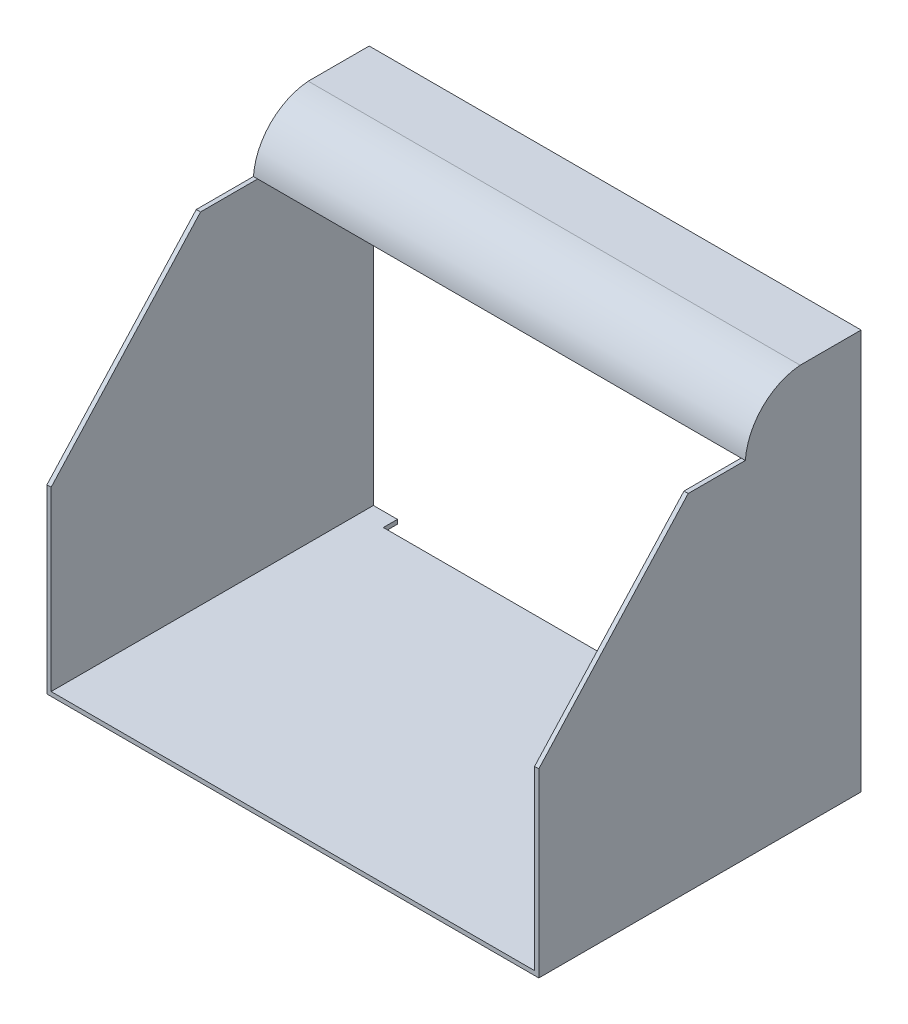
ISO-10303-21;
HEADER;
FILE_DESCRIPTION(('STEP AP214'),'2;1');
FILE_NAME('part.step','',(''),(''),'','','');
FILE_SCHEMA(('AUTOMOTIVE_DESIGN { 1 0 10303 214 1 1 1 1 }'));
ENDSEC;
DATA;
#1=APPLICATION_CONTEXT('core data for automotive mechanical design processes');
#2=APPLICATION_PROTOCOL_DEFINITION('international standard','automotive_design',2000,#1);
#3=PRODUCT_CONTEXT('',#1,'mechanical');
#4=PRODUCT('Part','Part','',(#3));
#5=PRODUCT_RELATED_PRODUCT_CATEGORY('part','',(#4));
#6=PRODUCT_DEFINITION_FORMATION('','',#4);
#7=PRODUCT_DEFINITION_CONTEXT('part definition',#1,'design');
#8=PRODUCT_DEFINITION('design','',#6,#7);
#9=PRODUCT_DEFINITION_SHAPE('','',#8);
#10=(LENGTH_UNIT() NAMED_UNIT(*) SI_UNIT(.MILLI.,.METRE.));
#11=(NAMED_UNIT(*) PLANE_ANGLE_UNIT() SI_UNIT($,.RADIAN.));
#12=(NAMED_UNIT(*) SI_UNIT($,.STERADIAN.) SOLID_ANGLE_UNIT());
#13=UNCERTAINTY_MEASURE_WITH_UNIT(LENGTH_MEASURE(1.E-05),#10,'distance_accuracy_value','');
#14=(GEOMETRIC_REPRESENTATION_CONTEXT(3) GLOBAL_UNCERTAINTY_ASSIGNED_CONTEXT((#13)) GLOBAL_UNIT_ASSIGNED_CONTEXT((#10,
#11,#12)) REPRESENTATION_CONTEXT('',''));
#15=CARTESIAN_POINT('',(0.,0.,0.));
#16=DIRECTION('',(0.,0.,1.));
#17=DIRECTION('',(1.,0.,0.));
#18=AXIS2_PLACEMENT_3D('',#15,#16,#17);
#19=CARTESIAN_POINT('',(174.,-18.,59.6619917569432));
#20=DIRECTION('',(0.,1.,0.));
#21=DIRECTION('',(0.,0.,1.));
#22=AXIS2_PLACEMENT_3D('',#19,#20,#21);
#23=PLANE('',#22);
#24=DIRECTION('',(-1.,0.,0.));
#25=VECTOR('',#24,1.);
#26=CARTESIAN_POINT('',(174.,-18.,59.6619917569432));
#27=LINE('',#26,#25);
#28=CARTESIAN_POINT('',(1.5,-18.,59.6619917569432));
#29=VERTEX_POINT('',#28);
#30=CARTESIAN_POINT('',(0.,-18.,59.6619917569432));
#31=VERTEX_POINT('',#30);
#32=EDGE_CURVE('E356',#29,#31,#27,.T.);
#33=ORIENTED_EDGE('',*,*,#32,.F.);
#34=DIRECTION('',(0.,0.,-1.));
#35=VECTOR('',#34,1.);
#36=CARTESIAN_POINT('',(1.5,-18.,18.4375));
#37=LINE('',#36,#35);
#38=CARTESIAN_POINT('',(1.5,-18.,39.446519640383));
#39=VERTEX_POINT('',#38);
#40=EDGE_CURVE('E234',#29,#39,#37,.T.);
#41=ORIENTED_EDGE('',*,*,#40,.T.);
#42=DIRECTION('',(-1.,0.,0.));
#43=VECTOR('',#42,1.);
#44=CARTESIAN_POINT('',(174.,-18.,39.446519640383));
#45=LINE('',#44,#43);
#46=CARTESIAN_POINT('',(0.,-18.,39.446519640383));
#47=VERTEX_POINT('',#46);
#48=EDGE_CURVE('E57',#39,#47,#45,.T.);
#49=ORIENTED_EDGE('',*,*,#48,.T.);
#50=DIRECTION('',(0.,0.,-1.));
#51=VECTOR('',#50,1.);
#52=CARTESIAN_POINT('',(0.,-18.,59.6619917569432));
#53=LINE('',#52,#51);
#54=EDGE_CURVE('E302',#31,#47,#53,.T.);
#55=ORIENTED_EDGE('',*,*,#54,.F.);
#56=EDGE_LOOP('',(#33,#41,#49,#55));
#57=FACE_BOUND('',#56,.T.);
#58=ADVANCED_FACE('F45',(#57),#23,.T.);
#59=CARTESIAN_POINT('',(174.,-75.9185859587353,112.5));
#60=DIRECTION('',(0.,0.673961987522216,0.738766024783967));
#61=DIRECTION('',(0.,-0.738766024783967,0.673961987522216));
#62=AXIS2_PLACEMENT_3D('',#59,#60,#61);
#63=PLANE('',#62);
#64=DIRECTION('',(-1.,0.,0.));
#65=VECTOR('',#64,1.);
#66=CARTESIAN_POINT('',(174.,-75.9185859587353,112.5));
#67=LINE('',#66,#65);
#68=CARTESIAN_POINT('',(1.5,-75.9185859587353,112.5));
#69=VERTEX_POINT('',#68);
#70=CARTESIAN_POINT('',(0.,-75.9185859587353,112.5));
#71=VERTEX_POINT('',#70);
#72=EDGE_CURVE('E361',#69,#71,#67,.T.);
#73=ORIENTED_EDGE('',*,*,#72,.F.);
#74=DIRECTION('',(0.,0.738766024783967,-0.673961987522216));
#75=VECTOR('',#74,1.);
#76=CARTESIAN_POINT('',(1.5,1.70702058921211,41.6836571843286));
#77=LINE('',#76,#75);
#78=EDGE_CURVE('E266',#69,#29,#77,.T.);
#79=ORIENTED_EDGE('',*,*,#78,.T.);
#80=ORIENTED_EDGE('',*,*,#32,.T.);
#81=DIRECTION('',(0.,0.738766024783967,-0.673961987522216));
#82=VECTOR('',#81,1.);
#83=CARTESIAN_POINT('',(0.,-75.9185859587353,112.5));
#84=LINE('',#83,#82);
#85=EDGE_CURVE('E345',#71,#31,#84,.T.);
#86=ORIENTED_EDGE('',*,*,#85,.F.);
#87=EDGE_LOOP('',(#73,#79,#80,#86));
#88=FACE_BOUND('',#87,.T.);
#89=ADVANCED_FACE('F430',(#88),#63,.T.);
#90=CARTESIAN_POINT('',(174.,-140.,112.5));
#91=DIRECTION('',(0.,0.,1.));
#92=DIRECTION('',(1.,0.,0.));
#93=AXIS2_PLACEMENT_3D('',#90,#91,#92);
#94=PLANE('',#93);
#95=DIRECTION('',(-1.,0.,0.));
#96=VECTOR('',#95,1.);
#97=CARTESIAN_POINT('',(174.,-138.5,112.5));
#98=LINE('',#97,#96);
#99=CARTESIAN_POINT('',(172.5,-138.5,112.5));
#100=VERTEX_POINT('',#99);
#101=CARTESIAN_POINT('',(1.5,-138.5,112.5));
#102=VERTEX_POINT('',#101);
#103=EDGE_CURVE('E261',#100,#102,#98,.T.);
#104=ORIENTED_EDGE('',*,*,#103,.T.);
#105=DIRECTION('',(0.,1.,0.));
#106=VECTOR('',#105,1.);
#107=CARTESIAN_POINT('',(1.5,-19.5,112.5));
#108=LINE('',#107,#106);
#109=EDGE_CURVE('E255',#102,#69,#108,.T.);
#110=ORIENTED_EDGE('',*,*,#109,.T.);
#111=ORIENTED_EDGE('',*,*,#72,.T.);
#112=DIRECTION('',(0.,1.,0.));
#113=VECTOR('',#112,1.);
#114=CARTESIAN_POINT('',(0.,-140.,112.5));
#115=LINE('',#114,#113);
#116=CARTESIAN_POINT('',(0.,-140.,112.5));
#117=VERTEX_POINT('',#116);
#118=EDGE_CURVE('E341',#117,#71,#115,.T.);
#119=ORIENTED_EDGE('',*,*,#118,.F.);
#120=DIRECTION('',(-1.,0.,0.));
#121=VECTOR('',#120,1.);
#122=CARTESIAN_POINT('',(174.,-140.,112.5));
#123=LINE('',#122,#121);
#124=CARTESIAN_POINT('',(174.,-140.,112.5));
#125=VERTEX_POINT('',#124);
#126=EDGE_CURVE('E362',#125,#117,#123,.T.);
#127=ORIENTED_EDGE('',*,*,#126,.F.);
#128=DIRECTION('',(0.,1.,0.));
#129=VECTOR('',#128,1.);
#130=CARTESIAN_POINT('',(174.,-140.,112.5));
#131=LINE('',#130,#129);
#132=CARTESIAN_POINT('',(174.,-75.9185859587353,112.5));
#133=VERTEX_POINT('',#132);
#134=EDGE_CURVE('E314',#125,#133,#131,.T.);
#135=ORIENTED_EDGE('',*,*,#134,.T.);
#136=CARTESIAN_POINT('',(172.5,-75.9185859587353,112.5));
#137=VERTEX_POINT('',#136);
#138=EDGE_CURVE('E357',#133,#137,#67,.T.);
#139=ORIENTED_EDGE('',*,*,#138,.T.);
#140=DIRECTION('',(0.,1.,0.));
#141=VECTOR('',#140,1.);
#142=CARTESIAN_POINT('',(172.5,-19.5,112.5));
#143=LINE('',#142,#141);
#144=EDGE_CURVE('E250',#100,#137,#143,.T.);
#145=ORIENTED_EDGE('',*,*,#144,.F.);
#146=EDGE_LOOP('',(#104,#110,#111,#119,#127,#135,#139,#145));
#147=FACE_BOUND('',#146,.T.);
#148=ADVANCED_FACE('F436',(#147),#94,.T.);
#149=CARTESIAN_POINT('',(174.,1.5,-1.5));
#150=DIRECTION('',(0.,0.,-1.));
#151=DIRECTION('',(-1.,0.,0.));
#152=AXIS2_PLACEMENT_3D('',#149,#150,#151);
#153=PLANE('',#152);
#154=DIRECTION('',(0.,-1.,0.));
#155=VECTOR('',#154,1.);
#156=CARTESIAN_POINT('',(164.,154.081147451594,-1.49999999999999));
#157=LINE('',#156,#155);
#158=CARTESIAN_POINT('',(164.,-138.5,-1.49999999999999));
#159=VERTEX_POINT('',#158);
#160=CARTESIAN_POINT('',(164.,-140.,-1.49999999999999));
#161=VERTEX_POINT('',#160);
#162=EDGE_CURVE('E197',#159,#161,#157,.T.);
#163=ORIENTED_EDGE('',*,*,#162,.F.);
#164=DIRECTION('',(-1.,0.,0.));
#165=VECTOR('',#164,1.);
#166=CARTESIAN_POINT('',(174.,-138.5,-1.5));
#167=LINE('',#166,#165);
#168=CARTESIAN_POINT('',(172.5,-138.5,-1.5));
#169=VERTEX_POINT('',#168);
#170=EDGE_CURVE('E276',#169,#159,#167,.T.);
#171=ORIENTED_EDGE('',*,*,#170,.F.);
#172=DIRECTION('',(0.,-1.,0.));
#173=VECTOR('',#172,1.);
#174=CARTESIAN_POINT('',(172.5,-19.5,-1.5));
#175=LINE('',#174,#173);
#176=CARTESIAN_POINT('',(172.5,0.,-1.5));
#177=VERTEX_POINT('',#176);
#178=EDGE_CURVE('E247',#177,#169,#175,.T.);
#179=ORIENTED_EDGE('',*,*,#178,.F.);
#180=DIRECTION('',(-1.,0.,0.));
#181=VECTOR('',#180,1.);
#182=CARTESIAN_POINT('',(174.,0.,-1.5));
#183=LINE('',#182,#181);
#184=CARTESIAN_POINT('',(1.5,0.,-1.5));
#185=VERTEX_POINT('',#184);
#186=EDGE_CURVE('E238',#177,#185,#183,.T.);
#187=ORIENTED_EDGE('',*,*,#186,.T.);
#188=DIRECTION('',(0.,-1.,0.));
#189=VECTOR('',#188,1.);
#190=CARTESIAN_POINT('',(1.5,-19.5,-1.5));
#191=LINE('',#190,#189);
#192=CARTESIAN_POINT('',(1.5,-138.5,-1.5));
#193=VERTEX_POINT('',#192);
#194=EDGE_CURVE('E243',#185,#193,#191,.T.);
#195=ORIENTED_EDGE('',*,*,#194,.T.);
#196=CARTESIAN_POINT('',(10.,-138.5,-1.5));
#197=VERTEX_POINT('',#196);
#198=EDGE_CURVE('E288',#197,#193,#167,.T.);
#199=ORIENTED_EDGE('',*,*,#198,.F.);
#200=DIRECTION('',(0.,-1.,0.));
#201=VECTOR('',#200,1.);
#202=CARTESIAN_POINT('',(10.,154.081147451594,-1.49999999999999));
#203=LINE('',#202,#201);
#204=CARTESIAN_POINT('',(10.,-140.,-1.49999999999999));
#205=VERTEX_POINT('',#204);
#206=EDGE_CURVE('E64',#197,#205,#203,.T.);
#207=ORIENTED_EDGE('',*,*,#206,.T.);
#208=DIRECTION('',(-1.,0.,0.));
#209=VECTOR('',#208,1.);
#210=CARTESIAN_POINT('',(174.,-140.,-1.5));
#211=LINE('',#210,#209);
#212=CARTESIAN_POINT('',(0.,-140.,-1.5));
#213=VERTEX_POINT('',#212);
#214=EDGE_CURVE('E203',#205,#213,#211,.T.);
#215=ORIENTED_EDGE('',*,*,#214,.T.);
#216=DIRECTION('',(0.,-1.,0.));
#217=VECTOR('',#216,1.);
#218=CARTESIAN_POINT('',(0.,1.5,-1.5));
#219=LINE('',#218,#217);
#220=CARTESIAN_POINT('',(0.,1.5,-1.5));
#221=VERTEX_POINT('',#220);
#222=EDGE_CURVE('E333',#221,#213,#219,.T.);
#223=ORIENTED_EDGE('',*,*,#222,.F.);
#224=DIRECTION('',(-1.,0.,0.));
#225=VECTOR('',#224,1.);
#226=CARTESIAN_POINT('',(174.,1.5,-1.5));
#227=LINE('',#226,#225);
#228=CARTESIAN_POINT('',(174.,1.5,-1.5));
#229=VERTEX_POINT('',#228);
#230=EDGE_CURVE('E368',#229,#221,#227,.T.);
#231=ORIENTED_EDGE('',*,*,#230,.F.);
#232=DIRECTION('',(0.,-1.,0.));
#233=VECTOR('',#232,1.);
#234=CARTESIAN_POINT('',(174.,1.5,-1.5));
#235=LINE('',#234,#233);
#236=CARTESIAN_POINT('',(174.,-140.,-1.5));
#237=VERTEX_POINT('',#236);
#238=EDGE_CURVE('E306',#229,#237,#235,.T.);
#239=ORIENTED_EDGE('',*,*,#238,.T.);
#240=EDGE_CURVE('E365',#237,#161,#211,.T.);
#241=ORIENTED_EDGE('',*,*,#240,.T.);
#242=EDGE_LOOP('',(#163,#171,#179,#187,#195,#199,#207,#215,#223,#231,#239,#241));
#243=FACE_BOUND('',#242,.T.);
#244=ADVANCED_FACE('F408',(#243),#153,.T.);
#245=CARTESIAN_POINT('',(174.,-19.5,18.4375));
#246=DIRECTION('',(-1.,0.,0.));
#247=DIRECTION('',(0.,0.,1.));
#248=AXIS2_PLACEMENT_3D('',#245,#246,#247);
#249=CYLINDRICAL_SURFACE('',#248,21.0625);
#250=CARTESIAN_POINT('',(0.,-19.5,18.4375));
#251=DIRECTION('',(-1.,0.,0.));
#252=DIRECTION('',(0.,0.,1.));
#253=AXIS2_PLACEMENT_3D('',#250,#251,#252);
#254=CIRCLE('',#253,21.0625);
#255=CARTESIAN_POINT('',(0.,1.5,20.0588902213841));
#256=VERTEX_POINT('',#255);
#257=EDGE_CURVE('E260',#47,#256,#254,.T.);
#258=ORIENTED_EDGE('',*,*,#257,.F.);
#259=ORIENTED_EDGE('',*,*,#48,.F.);
#260=CARTESIAN_POINT('',(172.5,-18.,39.446519640383));
#261=VERTEX_POINT('',#260);
#262=EDGE_CURVE('E55',#261,#39,#45,.T.);
#263=ORIENTED_EDGE('',*,*,#262,.F.);
#264=CARTESIAN_POINT('',(174.,-18.,39.446519640383));
#265=VERTEX_POINT('',#264);
#266=EDGE_CURVE('E11',#265,#261,#45,.T.);
#267=ORIENTED_EDGE('',*,*,#266,.F.);
#268=CARTESIAN_POINT('',(174.,-19.5,18.4375));
#269=DIRECTION('',(-1.,0.,0.));
#270=DIRECTION('',(0.,0.,1.));
#271=AXIS2_PLACEMENT_3D('',#268,#269,#270);
#272=CIRCLE('',#271,21.0625);
#273=CARTESIAN_POINT('',(174.,1.5,20.0588902213841));
#274=VERTEX_POINT('',#273);
#275=EDGE_CURVE('E297',#265,#274,#272,.T.);
#276=ORIENTED_EDGE('',*,*,#275,.T.);
#277=DIRECTION('',(-1.,0.,0.));
#278=VECTOR('',#277,1.);
#279=CARTESIAN_POINT('',(174.,1.5,20.0588902213841));
#280=LINE('',#279,#278);
#281=EDGE_CURVE('E49',#274,#256,#280,.T.);
#282=ORIENTED_EDGE('',*,*,#281,.T.);
#283=EDGE_LOOP('',(#258,#259,#263,#267,#276,#282));
#284=FACE_BOUND('',#283,.T.);
#285=ADVANCED_FACE('F47',(#284),#249,.T.);
#286=DIRECTION('',(0.,0.,-1.));
#287=VECTOR('',#286,1.);
#288=CARTESIAN_POINT('',(172.5,-18.,18.4375));
#289=LINE('',#288,#287);
#290=CARTESIAN_POINT('',(172.5,-18.,59.6619917569432));
#291=VERTEX_POINT('',#290);
#292=EDGE_CURVE('E239',#291,#261,#289,.T.);
#293=ORIENTED_EDGE('',*,*,#292,.F.);
#294=CARTESIAN_POINT('',(174.,-18.,59.6619917569432));
#295=VERTEX_POINT('',#294);
#296=EDGE_CURVE('E352',#295,#291,#27,.T.);
#297=ORIENTED_EDGE('',*,*,#296,.F.);
#298=DIRECTION('',(0.,0.,-1.));
#299=VECTOR('',#298,1.);
#300=CARTESIAN_POINT('',(174.,-18.,59.6619917569432));
#301=LINE('',#300,#299);
#302=EDGE_CURVE('E322',#295,#265,#301,.T.);
#303=ORIENTED_EDGE('',*,*,#302,.T.);
#304=ORIENTED_EDGE('',*,*,#266,.T.);
#305=EDGE_LOOP('',(#293,#297,#303,#304));
#306=FACE_BOUND('',#305,.T.);
#307=ADVANCED_FACE('F432',(#306),#23,.T.);
#308=DIRECTION('',(0.,0.738766024783967,-0.673961987522216));
#309=VECTOR('',#308,1.);
#310=CARTESIAN_POINT('',(172.5,1.70702058921211,41.6836571843286));
#311=LINE('',#310,#309);
#312=EDGE_CURVE('E279',#137,#291,#311,.T.);
#313=ORIENTED_EDGE('',*,*,#312,.F.);
#314=ORIENTED_EDGE('',*,*,#138,.F.);
#315=DIRECTION('',(0.,0.738766024783967,-0.673961987522216));
#316=VECTOR('',#315,1.);
#317=CARTESIAN_POINT('',(174.,-75.9185859587353,112.5));
#318=LINE('',#317,#316);
#319=EDGE_CURVE('E318',#133,#295,#318,.T.);
#320=ORIENTED_EDGE('',*,*,#319,.T.);
#321=ORIENTED_EDGE('',*,*,#296,.T.);
#322=EDGE_LOOP('',(#313,#314,#320,#321));
#323=FACE_BOUND('',#322,.T.);
#324=ADVANCED_FACE('F439',(#323),#63,.T.);
#325=CARTESIAN_POINT('',(174.,-140.,-1.5));
#326=DIRECTION('',(0.,-1.,0.));
#327=DIRECTION('',(0.,0.,-1.));
#328=AXIS2_PLACEMENT_3D('',#325,#326,#327);
#329=PLANE('',#328);
#330=DIRECTION('',(0.,0.,1.));
#331=VECTOR('',#330,1.);
#332=CARTESIAN_POINT('',(164.,-140.,-1.49999999999999));
#333=LINE('',#332,#331);
#334=CARTESIAN_POINT('',(164.,-140.,3.50000000000001));
#335=VERTEX_POINT('',#334);
#336=EDGE_CURVE('E198',#161,#335,#333,.T.);
#337=ORIENTED_EDGE('',*,*,#336,.F.);
#338=ORIENTED_EDGE('',*,*,#240,.F.);
#339=DIRECTION('',(0.,0.,1.));
#340=VECTOR('',#339,1.);
#341=CARTESIAN_POINT('',(174.,-140.,-1.5));
#342=LINE('',#341,#340);
#343=EDGE_CURVE('E310',#237,#125,#342,.T.);
#344=ORIENTED_EDGE('',*,*,#343,.T.);
#345=ORIENTED_EDGE('',*,*,#126,.T.);
#346=DIRECTION('',(0.,0.,1.));
#347=VECTOR('',#346,1.);
#348=CARTESIAN_POINT('',(0.,-140.,-1.5));
#349=LINE('',#348,#347);
#350=EDGE_CURVE('E337',#213,#117,#349,.T.);
#351=ORIENTED_EDGE('',*,*,#350,.F.);
#352=ORIENTED_EDGE('',*,*,#214,.F.);
#353=DIRECTION('',(0.,0.,-1.));
#354=VECTOR('',#353,1.);
#355=CARTESIAN_POINT('',(10.,-140.,-1.49999999999999));
#356=LINE('',#355,#354);
#357=CARTESIAN_POINT('',(10.,-140.,3.50000000000001));
#358=VERTEX_POINT('',#357);
#359=EDGE_CURVE('E182',#358,#205,#356,.T.);
#360=ORIENTED_EDGE('',*,*,#359,.F.);
#361=DIRECTION('',(-1.,0.,0.));
#362=VECTOR('',#361,1.);
#363=CARTESIAN_POINT('',(10.,-140.,3.50000000000001));
#364=LINE('',#363,#362);
#365=EDGE_CURVE('E190',#335,#358,#364,.T.);
#366=ORIENTED_EDGE('',*,*,#365,.F.);
#367=EDGE_LOOP('',(#337,#338,#344,#345,#351,#352,#360,#366));
#368=FACE_BOUND('',#367,.T.);
#369=ADVANCED_FACE('F201',(#368),#329,.T.);
#370=CARTESIAN_POINT('',(174.,1.5,20.0588902213841));
#371=DIRECTION('',(0.,1.,0.));
#372=DIRECTION('',(0.,0.,1.));
#373=AXIS2_PLACEMENT_3D('',#370,#371,#372);
#374=PLANE('',#373);
#375=DIRECTION('',(0.,0.,-1.));
#376=VECTOR('',#375,1.);
#377=CARTESIAN_POINT('',(0.,1.5,20.0588902213841));
#378=LINE('',#377,#376);
#379=EDGE_CURVE('E329',#256,#221,#378,.T.);
#380=ORIENTED_EDGE('',*,*,#379,.F.);
#381=ORIENTED_EDGE('',*,*,#281,.F.);
#382=DIRECTION('',(0.,0.,-1.));
#383=VECTOR('',#382,1.);
#384=CARTESIAN_POINT('',(174.,1.5,20.0588902213841));
#385=LINE('',#384,#383);
#386=EDGE_CURVE('E301',#274,#229,#385,.T.);
#387=ORIENTED_EDGE('',*,*,#386,.T.);
#388=ORIENTED_EDGE('',*,*,#230,.T.);
#389=EDGE_LOOP('',(#380,#381,#387,#388));
#390=FACE_BOUND('',#389,.T.);
#391=ADVANCED_FACE('F380',(#390),#374,.T.);
#392=CARTESIAN_POINT('',(174.,-19.5,18.4375));
#393=DIRECTION('',(-1.,0.,0.));
#394=DIRECTION('',(0.,0.,1.));
#395=AXIS2_PLACEMENT_3D('',#392,#393,#394);
#396=PLANE('',#395);
#397=ORIENTED_EDGE('',*,*,#275,.F.);
#398=ORIENTED_EDGE('',*,*,#302,.F.);
#399=ORIENTED_EDGE('',*,*,#319,.F.);
#400=ORIENTED_EDGE('',*,*,#134,.F.);
#401=ORIENTED_EDGE('',*,*,#343,.F.);
#402=ORIENTED_EDGE('',*,*,#238,.F.);
#403=ORIENTED_EDGE('',*,*,#386,.F.);
#404=EDGE_LOOP('',(#397,#398,#399,#400,#401,#402,#403));
#405=FACE_BOUND('',#404,.T.);
#406=ADVANCED_FACE('F426',(#405),#396,.F.);
#407=CARTESIAN_POINT('',(0.,-19.5,18.4375));
#408=DIRECTION('',(-1.,0.,0.));
#409=DIRECTION('',(0.,0.,1.));
#410=AXIS2_PLACEMENT_3D('',#407,#408,#409);
#411=PLANE('',#410);
#412=ORIENTED_EDGE('',*,*,#257,.T.);
#413=ORIENTED_EDGE('',*,*,#379,.T.);
#414=ORIENTED_EDGE('',*,*,#222,.T.);
#415=ORIENTED_EDGE('',*,*,#350,.T.);
#416=ORIENTED_EDGE('',*,*,#118,.T.);
#417=ORIENTED_EDGE('',*,*,#85,.T.);
#418=ORIENTED_EDGE('',*,*,#54,.T.);
#419=EDGE_LOOP('',(#412,#413,#414,#415,#416,#417,#418));
#420=FACE_BOUND('',#419,.T.);
#421=ADVANCED_FACE('F382',(#420),#411,.T.);
#422=CARTESIAN_POINT('',(174.,-19.5,18.4375));
#423=DIRECTION('',(-1.,0.,0.));
#424=DIRECTION('',(0.,0.,1.));
#425=AXIS2_PLACEMENT_3D('',#422,#423,#424);
#426=CYLINDRICAL_SURFACE('',#425,19.5625);
#427=CARTESIAN_POINT('',(1.5,-19.5,18.4375));
#428=DIRECTION('',(-1.,0.,0.));
#429=DIRECTION('',(0.,0.,1.));
#430=AXIS2_PLACEMENT_3D('',#427,#428,#429);
#431=CIRCLE('',#430,19.5625);
#432=CARTESIAN_POINT('',(1.5,-18.,37.9424072351037));
#433=VERTEX_POINT('',#432);
#434=CARTESIAN_POINT('',(1.5,0.,20.));
#435=VERTEX_POINT('',#434);
#436=EDGE_CURVE('E224',#433,#435,#431,.T.);
#437=ORIENTED_EDGE('',*,*,#436,.T.);
#438=DIRECTION('',(-1.,0.,0.));
#439=VECTOR('',#438,1.);
#440=CARTESIAN_POINT('',(172.5,0.,20.));
#441=LINE('',#440,#439);
#442=CARTESIAN_POINT('',(172.5,0.,20.));
#443=VERTEX_POINT('',#442);
#444=EDGE_CURVE('E235',#443,#435,#441,.T.);
#445=ORIENTED_EDGE('',*,*,#444,.F.);
#446=CARTESIAN_POINT('',(172.5,-19.5,18.4375));
#447=DIRECTION('',(-1.,0.,0.));
#448=DIRECTION('',(0.,0.,1.));
#449=AXIS2_PLACEMENT_3D('',#446,#447,#448);
#450=CIRCLE('',#449,19.5625);
#451=CARTESIAN_POINT('',(172.5,-18.,37.9424072351037));
#452=VERTEX_POINT('',#451);
#453=EDGE_CURVE('E229',#452,#443,#450,.T.);
#454=ORIENTED_EDGE('',*,*,#453,.F.);
#455=DIRECTION('',(-1.,0.,0.));
#456=VECTOR('',#455,1.);
#457=CARTESIAN_POINT('',(172.5,-18.,37.9424072351037));
#458=LINE('',#457,#456);
#459=EDGE_CURVE('E256',#452,#433,#458,.T.);
#460=ORIENTED_EDGE('',*,*,#459,.T.);
#461=EDGE_LOOP('',(#437,#445,#454,#460));
#462=FACE_BOUND('',#461,.T.);
#463=ADVANCED_FACE('F417',(#462),#426,.F.);
#464=CARTESIAN_POINT('',(174.,-18.,59.6619917569432));
#465=DIRECTION('',(0.,1.,0.));
#466=DIRECTION('',(0.,0.,1.));
#467=AXIS2_PLACEMENT_3D('',#464,#465,#466);
#468=PLANE('',#467);
#469=ORIENTED_EDGE('',*,*,#262,.T.);
#470=EDGE_CURVE('E265',#39,#433,#37,.T.);
#471=ORIENTED_EDGE('',*,*,#470,.T.);
#472=ORIENTED_EDGE('',*,*,#459,.F.);
#473=EDGE_CURVE('E282',#261,#452,#289,.T.);
#474=ORIENTED_EDGE('',*,*,#473,.F.);
#475=EDGE_LOOP('',(#469,#471,#472,#474));
#476=FACE_BOUND('',#475,.T.);
#477=ADVANCED_FACE('F392',(#476),#468,.F.);
#478=CARTESIAN_POINT('',(174.,-138.5,-1.5));
#479=DIRECTION('',(0.,-1.,0.));
#480=DIRECTION('',(0.,0.,-1.));
#481=AXIS2_PLACEMENT_3D('',#478,#479,#480);
#482=PLANE('',#481);
#483=ORIENTED_EDGE('',*,*,#170,.T.);
#484=DIRECTION('',(0.,0.,1.));
#485=VECTOR('',#484,1.);
#486=CARTESIAN_POINT('',(164.,-138.5,-1.5));
#487=LINE('',#486,#485);
#488=CARTESIAN_POINT('',(164.,-138.5,3.50000000000001));
#489=VERTEX_POINT('',#488);
#490=EDGE_CURVE('E220',#159,#489,#487,.T.);
#491=ORIENTED_EDGE('',*,*,#490,.T.);
#492=DIRECTION('',(-1.,0.,0.));
#493=VECTOR('',#492,1.);
#494=CARTESIAN_POINT('',(174.,-138.5,3.50000000000001));
#495=LINE('',#494,#493);
#496=CARTESIAN_POINT('',(10.,-138.5,3.50000000000001));
#497=VERTEX_POINT('',#496);
#498=EDGE_CURVE('E217',#489,#497,#495,.T.);
#499=ORIENTED_EDGE('',*,*,#498,.T.);
#500=DIRECTION('',(0.,0.,-1.));
#501=VECTOR('',#500,1.);
#502=CARTESIAN_POINT('',(10.,-138.5,-1.5));
#503=LINE('',#502,#501);
#504=EDGE_CURVE('E183',#497,#197,#503,.T.);
#505=ORIENTED_EDGE('',*,*,#504,.T.);
#506=ORIENTED_EDGE('',*,*,#198,.T.);
#507=DIRECTION('',(0.,0.,1.));
#508=VECTOR('',#507,1.);
#509=CARTESIAN_POINT('',(1.5,-138.5,18.4375));
#510=LINE('',#509,#508);
#511=EDGE_CURVE('E251',#193,#102,#510,.T.);
#512=ORIENTED_EDGE('',*,*,#511,.T.);
#513=ORIENTED_EDGE('',*,*,#103,.F.);
#514=DIRECTION('',(0.,0.,1.));
#515=VECTOR('',#514,1.);
#516=CARTESIAN_POINT('',(172.5,-138.5,18.4375));
#517=LINE('',#516,#515);
#518=EDGE_CURVE('E72',#169,#100,#517,.T.);
#519=ORIENTED_EDGE('',*,*,#518,.F.);
#520=EDGE_LOOP('',(#483,#491,#499,#505,#506,#512,#513,#519));
#521=FACE_BOUND('',#520,.T.);
#522=ADVANCED_FACE('F404',(#521),#482,.F.);
#523=CARTESIAN_POINT('',(174.,0.,20.0588902213841));
#524=DIRECTION('',(0.,1.,0.));
#525=DIRECTION('',(0.,0.,1.));
#526=AXIS2_PLACEMENT_3D('',#523,#524,#525);
#527=PLANE('',#526);
#528=DIRECTION('',(0.,0.,-1.));
#529=VECTOR('',#528,1.);
#530=CARTESIAN_POINT('',(1.5,0.,18.4375));
#531=LINE('',#530,#529);
#532=EDGE_CURVE('E228',#435,#185,#531,.T.);
#533=ORIENTED_EDGE('',*,*,#532,.T.);
#534=ORIENTED_EDGE('',*,*,#186,.F.);
#535=DIRECTION('',(0.,0.,-1.));
#536=VECTOR('',#535,1.);
#537=CARTESIAN_POINT('',(172.5,0.,18.4375));
#538=LINE('',#537,#536);
#539=EDGE_CURVE('E233',#443,#177,#538,.T.);
#540=ORIENTED_EDGE('',*,*,#539,.F.);
#541=ORIENTED_EDGE('',*,*,#444,.T.);
#542=EDGE_LOOP('',(#533,#534,#540,#541));
#543=FACE_BOUND('',#542,.T.);
#544=ADVANCED_FACE('F413',(#543),#527,.F.);
#545=CARTESIAN_POINT('',(172.5,-19.5,18.4375));
#546=DIRECTION('',(-1.,0.,0.));
#547=DIRECTION('',(0.,0.,1.));
#548=AXIS2_PLACEMENT_3D('',#545,#546,#547);
#549=PLANE('',#548);
#550=ORIENTED_EDGE('',*,*,#453,.T.);
#551=ORIENTED_EDGE('',*,*,#539,.T.);
#552=ORIENTED_EDGE('',*,*,#178,.T.);
#553=ORIENTED_EDGE('',*,*,#518,.T.);
#554=ORIENTED_EDGE('',*,*,#144,.T.);
#555=ORIENTED_EDGE('',*,*,#312,.T.);
#556=ORIENTED_EDGE('',*,*,#292,.T.);
#557=ORIENTED_EDGE('',*,*,#473,.T.);
#558=EDGE_LOOP('',(#550,#551,#552,#553,#554,#555,#556,#557));
#559=FACE_BOUND('',#558,.T.);
#560=ADVANCED_FACE('F414',(#559),#549,.T.);
#561=CARTESIAN_POINT('',(1.5,-19.5,18.4375));
#562=DIRECTION('',(-1.,0.,0.));
#563=DIRECTION('',(0.,0.,1.));
#564=AXIS2_PLACEMENT_3D('',#561,#562,#563);
#565=PLANE('',#564);
#566=ORIENTED_EDGE('',*,*,#436,.F.);
#567=ORIENTED_EDGE('',*,*,#470,.F.);
#568=ORIENTED_EDGE('',*,*,#40,.F.);
#569=ORIENTED_EDGE('',*,*,#78,.F.);
#570=ORIENTED_EDGE('',*,*,#109,.F.);
#571=ORIENTED_EDGE('',*,*,#511,.F.);
#572=ORIENTED_EDGE('',*,*,#194,.F.);
#573=ORIENTED_EDGE('',*,*,#532,.F.);
#574=EDGE_LOOP('',(#566,#567,#568,#569,#570,#571,#572,#573));
#575=FACE_BOUND('',#574,.T.);
#576=ADVANCED_FACE('F396',(#575),#565,.F.);
#577=CARTESIAN_POINT('',(164.,154.081147451594,-1.49999999999999));
#578=DIRECTION('',(1.,0.,0.));
#579=DIRECTION('',(0.,0.,-1.));
#580=AXIS2_PLACEMENT_3D('',#577,#578,#579);
#581=PLANE('',#580);
#582=ORIENTED_EDGE('',*,*,#162,.T.);
#583=ORIENTED_EDGE('',*,*,#336,.T.);
#584=DIRECTION('',(0.,-1.,0.));
#585=VECTOR('',#584,1.);
#586=CARTESIAN_POINT('',(164.,154.081147451594,3.50000000000001));
#587=LINE('',#586,#585);
#588=EDGE_CURVE('E187',#489,#335,#587,.T.);
#589=ORIENTED_EDGE('',*,*,#588,.F.);
#590=ORIENTED_EDGE('',*,*,#490,.F.);
#591=EDGE_LOOP('',(#582,#583,#589,#590));
#592=FACE_BOUND('',#591,.T.);
#593=ADVANCED_FACE('F461',(#592),#581,.F.);
#594=CARTESIAN_POINT('',(10.,154.081147451594,3.50000000000001));
#595=DIRECTION('',(0.,0.,1.));
#596=DIRECTION('',(1.,0.,0.));
#597=AXIS2_PLACEMENT_3D('',#594,#595,#596);
#598=PLANE('',#597);
#599=ORIENTED_EDGE('',*,*,#588,.T.);
#600=ORIENTED_EDGE('',*,*,#365,.T.);
#601=DIRECTION('',(0.,-1.,0.));
#602=VECTOR('',#601,1.);
#603=CARTESIAN_POINT('',(10.,154.081147451594,3.50000000000001));
#604=LINE('',#603,#602);
#605=EDGE_CURVE('E178',#497,#358,#604,.T.);
#606=ORIENTED_EDGE('',*,*,#605,.F.);
#607=ORIENTED_EDGE('',*,*,#498,.F.);
#608=EDGE_LOOP('',(#599,#600,#606,#607));
#609=FACE_BOUND('',#608,.T.);
#610=ADVANCED_FACE('F191',(#609),#598,.F.);
#611=CARTESIAN_POINT('',(10.,154.081147451594,-1.49999999999999));
#612=DIRECTION('',(-1.,0.,0.));
#613=DIRECTION('',(0.,0.,1.));
#614=AXIS2_PLACEMENT_3D('',#611,#612,#613);
#615=PLANE('',#614);
#616=ORIENTED_EDGE('',*,*,#605,.T.);
#617=ORIENTED_EDGE('',*,*,#359,.T.);
#618=ORIENTED_EDGE('',*,*,#206,.F.);
#619=ORIENTED_EDGE('',*,*,#504,.F.);
#620=EDGE_LOOP('',(#616,#617,#618,#619));
#621=FACE_BOUND('',#620,.T.);
#622=ADVANCED_FACE('F180',(#621),#615,.F.);
#623=CLOSED_SHELL('',(#58,#89,#148,#244,#285,#307,#324,#369,#391,#406,#421,#463,#477,#522,#544,
#560,#576,#593,#610,#622));
#624=MANIFOLD_SOLID_BREP('B2',#623);
#625=ADVANCED_BREP_SHAPE_REPRESENTATION('',(#18,#624),#14);
#626=SHAPE_DEFINITION_REPRESENTATION(#9,#625);
ENDSEC;
END-ISO-10303-21;
